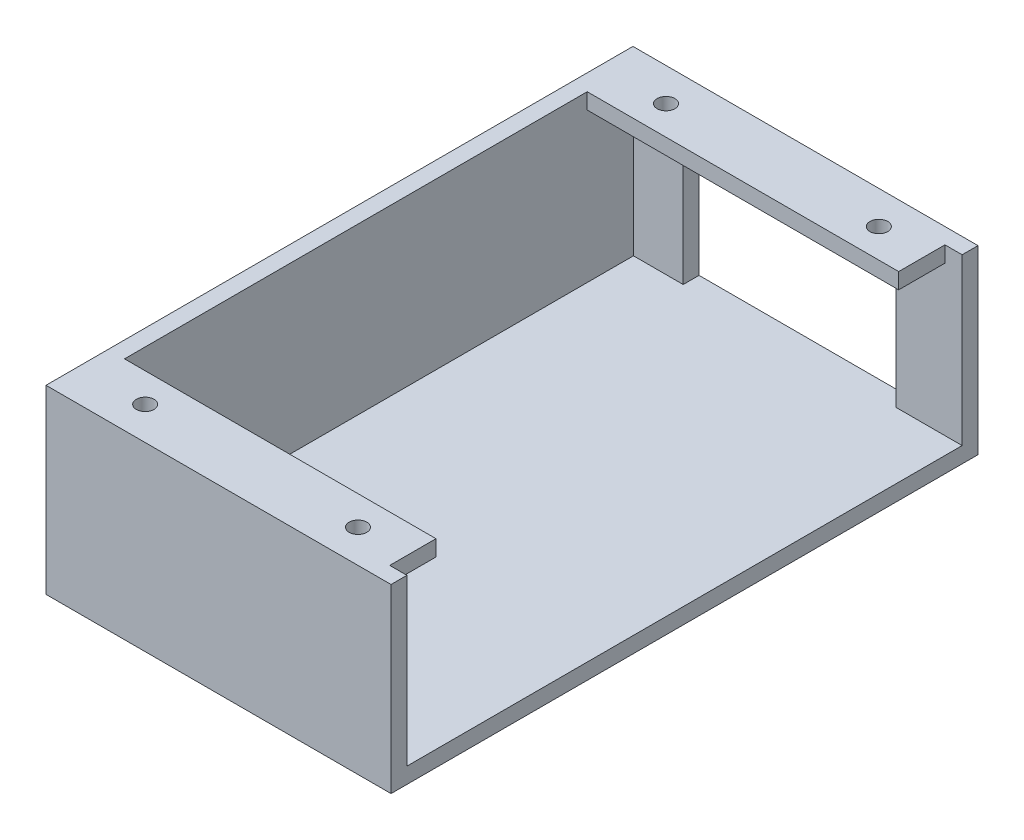
ISO-10303-21;
HEADER;
FILE_DESCRIPTION(('STEP AP214'),'2;1');
FILE_NAME('part.step','',(''),(''),'','','');
FILE_SCHEMA(('AUTOMOTIVE_DESIGN { 1 0 10303 214 1 1 1 1 }'));
ENDSEC;
DATA;
#1=APPLICATION_CONTEXT('core data for automotive mechanical design processes');
#2=APPLICATION_PROTOCOL_DEFINITION('international standard','automotive_design',2000,#1);
#3=PRODUCT_CONTEXT('',#1,'mechanical');
#4=PRODUCT('Part','Part','',(#3));
#5=PRODUCT_RELATED_PRODUCT_CATEGORY('part','',(#4));
#6=PRODUCT_DEFINITION_FORMATION('','',#4);
#7=PRODUCT_DEFINITION_CONTEXT('part definition',#1,'design');
#8=PRODUCT_DEFINITION('design','',#6,#7);
#9=PRODUCT_DEFINITION_SHAPE('','',#8);
#10=(LENGTH_UNIT() NAMED_UNIT(*) SI_UNIT(.MILLI.,.METRE.));
#11=(NAMED_UNIT(*) PLANE_ANGLE_UNIT() SI_UNIT($,.RADIAN.));
#12=(NAMED_UNIT(*) SI_UNIT($,.STERADIAN.) SOLID_ANGLE_UNIT());
#13=UNCERTAINTY_MEASURE_WITH_UNIT(LENGTH_MEASURE(1.E-05),#10,'distance_accuracy_value','');
#14=(GEOMETRIC_REPRESENTATION_CONTEXT(3) GLOBAL_UNCERTAINTY_ASSIGNED_CONTEXT((#13)) GLOBAL_UNIT_ASSIGNED_CONTEXT((#10,
#11,#12)) REPRESENTATION_CONTEXT('',''));
#15=CARTESIAN_POINT('',(0.,0.,0.));
#16=DIRECTION('',(0.,0.,1.));
#17=DIRECTION('',(1.,0.,0.));
#18=AXIS2_PLACEMENT_3D('',#15,#16,#17);
#19=CARTESIAN_POINT('',(0.,-5.08,10.16));
#20=DIRECTION('',(0.,0.,1.));
#21=DIRECTION('',(1.,0.,0.));
#22=AXIS2_PLACEMENT_3D('',#19,#20,#21);
#23=PLANE('',#22);
#24=DIRECTION('',(1.,0.,0.));
#25=VECTOR('',#24,1.);
#26=CARTESIAN_POINT('',(8.89,-2.54,10.16));
#27=LINE('',#26,#25);
#28=CARTESIAN_POINT('',(-8.89,-2.54,10.16));
#29=VERTEX_POINT('',#28);
#30=CARTESIAN_POINT('',(8.89,-2.54,10.16));
#31=VERTEX_POINT('',#30);
#32=EDGE_CURVE('E246',#29,#31,#27,.T.);
#33=ORIENTED_EDGE('',*,*,#32,.F.);
#34=DIRECTION('',(0.,1.,0.));
#35=VECTOR('',#34,1.);
#36=CARTESIAN_POINT('',(-8.89,-5.08,10.16));
#37=LINE('',#36,#35);
#38=CARTESIAN_POINT('',(-8.89,0.,10.16));
#39=VERTEX_POINT('',#38);
#40=EDGE_CURVE('E343',#29,#39,#37,.T.);
#41=ORIENTED_EDGE('',*,*,#40,.T.);
#42=DIRECTION('',(1.,0.,0.));
#43=VECTOR('',#42,1.);
#44=CARTESIAN_POINT('',(0.,0.,10.16));
#45=LINE('',#44,#43);
#46=CARTESIAN_POINT('',(8.89,0.,10.16));
#47=VERTEX_POINT('',#46);
#48=EDGE_CURVE('E330',#39,#47,#45,.T.);
#49=ORIENTED_EDGE('',*,*,#48,.T.);
#50=DIRECTION('',(0.,1.,0.));
#51=VECTOR('',#50,1.);
#52=CARTESIAN_POINT('',(8.89,-5.08,10.16));
#53=LINE('',#52,#51);
#54=EDGE_CURVE('E366',#31,#47,#53,.T.);
#55=ORIENTED_EDGE('',*,*,#54,.F.);
#56=EDGE_LOOP('',(#33,#41,#49,#55));
#57=FACE_BOUND('',#56,.T.);
#58=ADVANCED_FACE('F39',(#57),#23,.F.);
#59=CARTESIAN_POINT('',(0.,0.,0.));
#60=DIRECTION('',(0.,-1.,0.));
#61=DIRECTION('',(0.,0.,-1.));
#62=AXIS2_PLACEMENT_3D('',#59,#60,#61);
#63=PLANE('',#62);
#64=DIRECTION('',(0.,0.,-1.));
#65=VECTOR('',#64,1.);
#66=CARTESIAN_POINT('',(8.89000000000001,0.,0.));
#67=LINE('',#66,#65);
#68=CARTESIAN_POINT('',(8.89000000000001,0.,-10.16));
#69=VERTEX_POINT('',#68);
#70=CARTESIAN_POINT('',(8.89000000000001,0.,-15.24));
#71=VERTEX_POINT('',#70);
#72=EDGE_CURVE('E295',#69,#71,#67,.T.);
#73=ORIENTED_EDGE('',*,*,#72,.T.);
#74=DIRECTION('',(1.,0.,0.));
#75=VECTOR('',#74,1.);
#76=CARTESIAN_POINT('',(0.,0.,-15.24));
#77=LINE('',#76,#75);
#78=CARTESIAN_POINT('',(-8.89,0.,-15.24));
#79=VERTEX_POINT('',#78);
#80=EDGE_CURVE('E300',#79,#71,#77,.T.);
#81=ORIENTED_EDGE('',*,*,#80,.F.);
#82=DIRECTION('',(0.,0.,-1.));
#83=VECTOR('',#82,1.);
#84=CARTESIAN_POINT('',(-8.89,0.,0.));
#85=LINE('',#84,#83);
#86=CARTESIAN_POINT('',(-8.89,0.,-10.16));
#87=VERTEX_POINT('',#86);
#88=EDGE_CURVE('E314',#87,#79,#85,.T.);
#89=ORIENTED_EDGE('',*,*,#88,.F.);
#90=DIRECTION('',(1.,0.,0.));
#91=VECTOR('',#90,1.);
#92=CARTESIAN_POINT('',(0.,0.,-10.16));
#93=LINE('',#92,#91);
#94=EDGE_CURVE('E310',#87,#69,#93,.T.);
#95=ORIENTED_EDGE('',*,*,#94,.T.);
#96=EDGE_LOOP('',(#73,#81,#89,#95));
#97=FACE_BOUND('',#96,.T.);
#98=DIRECTION('',(1.,0.,0.));
#99=VECTOR('',#98,1.);
#100=CARTESIAN_POINT('',(-33.147,0.,-56.388));
#101=LINE('',#100,#99);
#102=CARTESIAN_POINT('',(-33.147,0.,-56.388));
#103=VERTEX_POINT('',#102);
#104=CARTESIAN_POINT('',(33.147,0.,-56.388));
#105=VERTEX_POINT('',#104);
#106=EDGE_CURVE('E554',#103,#105,#101,.T.);
#107=ORIENTED_EDGE('',*,*,#106,.T.);
#108=DIRECTION('',(0.,0.,1.));
#109=VECTOR('',#108,1.);
#110=CARTESIAN_POINT('',(33.147,0.,-56.388));
#111=LINE('',#110,#109);
#112=CARTESIAN_POINT('',(33.147,0.,56.388));
#113=VERTEX_POINT('',#112);
#114=EDGE_CURVE('E558',#105,#113,#111,.T.);
#115=ORIENTED_EDGE('',*,*,#114,.T.);
#116=DIRECTION('',(1.,0.,0.));
#117=VECTOR('',#116,1.);
#118=CARTESIAN_POINT('',(-33.147,0.,56.388));
#119=LINE('',#118,#117);
#120=CARTESIAN_POINT('',(-33.147,0.,56.388));
#121=VERTEX_POINT('',#120);
#122=EDGE_CURVE('E562',#121,#113,#119,.T.);
#123=ORIENTED_EDGE('',*,*,#122,.F.);
#124=DIRECTION('',(0.,0.,1.));
#125=VECTOR('',#124,1.);
#126=CARTESIAN_POINT('',(-33.147,0.,-56.388));
#127=LINE('',#126,#125);
#128=EDGE_CURVE('E566',#103,#121,#127,.T.);
#129=ORIENTED_EDGE('',*,*,#128,.F.);
#130=EDGE_LOOP('',(#107,#115,#123,#129));
#131=FACE_BOUND('',#130,.T.);
#132=DIRECTION('',(0.,0.,1.));
#133=VECTOR('',#132,1.);
#134=CARTESIAN_POINT('',(8.89,0.,0.));
#135=LINE('',#134,#133);
#136=CARTESIAN_POINT('',(8.89,0.,15.24));
#137=VERTEX_POINT('',#136);
#138=EDGE_CURVE('E347',#47,#137,#135,.T.);
#139=ORIENTED_EDGE('',*,*,#138,.F.);
#140=ORIENTED_EDGE('',*,*,#48,.F.);
#141=DIRECTION('',(0.,0.,1.));
#142=VECTOR('',#141,1.);
#143=CARTESIAN_POINT('',(-8.88999999999999,0.,0.));
#144=LINE('',#143,#142);
#145=CARTESIAN_POINT('',(-8.89,0.,15.24));
#146=VERTEX_POINT('',#145);
#147=EDGE_CURVE('E335',#39,#146,#144,.T.);
#148=ORIENTED_EDGE('',*,*,#147,.T.);
#149=DIRECTION('',(1.,0.,0.));
#150=VECTOR('',#149,1.);
#151=CARTESIAN_POINT('',(0.,0.,15.24));
#152=LINE('',#151,#150);
#153=EDGE_CURVE('E351',#146,#137,#152,.T.);
#154=ORIENTED_EDGE('',*,*,#153,.T.);
#155=EDGE_LOOP('',(#139,#140,#148,#154));
#156=FACE_BOUND('',#155,.T.);
#157=ADVANCED_FACE('F592',(#97,#131,#156),#63,.T.);
#158=CARTESIAN_POINT('',(-30.,34.798,-53.34));
#159=DIRECTION('',(0.,0.,1.));
#160=DIRECTION('',(1.,0.,0.));
#161=AXIS2_PLACEMENT_3D('',#158,#159,#160);
#162=PLANE('',#161);
#163=DIRECTION('',(0.,-1.,0.));
#164=VECTOR('',#163,1.);
#165=CARTESIAN_POINT('',(20.447,3.048,-53.34));
#166=LINE('',#165,#164);
#167=CARTESIAN_POINT('',(20.447,23.368,-53.34));
#168=VERTEX_POINT('',#167);
#169=CARTESIAN_POINT('',(20.447,3.048,-53.34));
#170=VERTEX_POINT('',#169);
#171=EDGE_CURVE('E369',#168,#170,#166,.T.);
#172=ORIENTED_EDGE('',*,*,#171,.T.);
#173=DIRECTION('',(-1.,0.,0.));
#174=VECTOR('',#173,1.);
#175=CARTESIAN_POINT('',(-30.,3.048,-53.34));
#176=LINE('',#175,#174);
#177=CARTESIAN_POINT('',(33.147,3.048,-53.34));
#178=VERTEX_POINT('',#177);
#179=EDGE_CURVE('E521',#178,#170,#176,.T.);
#180=ORIENTED_EDGE('',*,*,#179,.F.);
#181=DIRECTION('',(0.,1.,0.));
#182=VECTOR('',#181,1.);
#183=CARTESIAN_POINT('',(33.147,3.048,-53.34));
#184=LINE('',#183,#182);
#185=CARTESIAN_POINT('',(33.147,34.798,-53.34));
#186=VERTEX_POINT('',#185);
#187=EDGE_CURVE('E446',#178,#186,#184,.T.);
#188=ORIENTED_EDGE('',*,*,#187,.T.);
#189=DIRECTION('',(1.,0.,0.));
#190=VECTOR('',#189,1.);
#191=CARTESIAN_POINT('',(29.845,34.798,-53.34));
#192=LINE('',#191,#190);
#193=CARTESIAN_POINT('',(29.845,34.798,-53.34));
#194=VERTEX_POINT('',#193);
#195=EDGE_CURVE('E453',#194,#186,#192,.T.);
#196=ORIENTED_EDGE('',*,*,#195,.F.);
#197=DIRECTION('',(0.,1.,0.));
#198=VECTOR('',#197,1.);
#199=CARTESIAN_POINT('',(29.845,3.048,-53.34));
#200=LINE('',#199,#198);
#201=CARTESIAN_POINT('',(29.845,31.75,-53.34));
#202=VERTEX_POINT('',#201);
#203=EDGE_CURVE('E445',#202,#194,#200,.T.);
#204=ORIENTED_EDGE('',*,*,#203,.F.);
#205=DIRECTION('',(-1.,0.,0.));
#206=VECTOR('',#205,1.);
#207=CARTESIAN_POINT('',(-30.,31.75,-53.34));
#208=LINE('',#207,#206);
#209=CARTESIAN_POINT('',(-30.,31.75,-53.34));
#210=VERTEX_POINT('',#209);
#211=EDGE_CURVE('E504',#202,#210,#208,.T.);
#212=ORIENTED_EDGE('',*,*,#211,.T.);
#213=DIRECTION('',(0.,-1.,0.));
#214=VECTOR('',#213,1.);
#215=CARTESIAN_POINT('',(-30.,34.798,-53.34));
#216=LINE('',#215,#214);
#217=CARTESIAN_POINT('',(-30.,3.048,-53.34));
#218=VERTEX_POINT('',#217);
#219=EDGE_CURVE('E533',#210,#218,#216,.T.);
#220=ORIENTED_EDGE('',*,*,#219,.T.);
#221=CARTESIAN_POINT('',(-20.447,3.048,-53.34));
#222=VERTEX_POINT('',#221);
#223=EDGE_CURVE('E514',#222,#218,#176,.T.);
#224=ORIENTED_EDGE('',*,*,#223,.F.);
#225=DIRECTION('',(0.,1.,0.));
#226=VECTOR('',#225,1.);
#227=CARTESIAN_POINT('',(-20.447,3.048,-53.34));
#228=LINE('',#227,#226);
#229=CARTESIAN_POINT('',(-20.447,23.368,-53.34));
#230=VERTEX_POINT('',#229);
#231=EDGE_CURVE('E396',#222,#230,#228,.T.);
#232=ORIENTED_EDGE('',*,*,#231,.T.);
#233=DIRECTION('',(1.,0.,0.));
#234=VECTOR('',#233,1.);
#235=CARTESIAN_POINT('',(20.447,23.368,-53.34));
#236=LINE('',#235,#234);
#237=EDGE_CURVE('E391',#230,#168,#236,.T.);
#238=ORIENTED_EDGE('',*,*,#237,.T.);
#239=EDGE_LOOP('',(#172,#180,#188,#196,#204,#212,#220,#224,#232,#238));
#240=FACE_BOUND('',#239,.T.);
#241=ADVANCED_FACE('F635',(#240),#162,.T.);
#242=CARTESIAN_POINT('',(-33.147,3.048,-56.388));
#243=DIRECTION('',(0.,0.,-1.));
#244=DIRECTION('',(-1.,0.,0.));
#245=AXIS2_PLACEMENT_3D('',#242,#243,#244);
#246=PLANE('',#245);
#247=DIRECTION('',(0.,-1.,0.));
#248=VECTOR('',#247,1.);
#249=CARTESIAN_POINT('',(20.447,3.048,-56.388));
#250=LINE('',#249,#248);
#251=CARTESIAN_POINT('',(20.447,23.368,-56.388));
#252=VERTEX_POINT('',#251);
#253=CARTESIAN_POINT('',(20.447,3.048,-56.388));
#254=VERTEX_POINT('',#253);
#255=EDGE_CURVE('E383',#252,#254,#250,.T.);
#256=ORIENTED_EDGE('',*,*,#255,.F.);
#257=DIRECTION('',(1.,0.,0.));
#258=VECTOR('',#257,1.);
#259=CARTESIAN_POINT('',(20.447,23.368,-56.388));
#260=LINE('',#259,#258);
#261=CARTESIAN_POINT('',(-20.447,23.368,-56.388));
#262=VERTEX_POINT('',#261);
#263=EDGE_CURVE('E370',#262,#252,#260,.T.);
#264=ORIENTED_EDGE('',*,*,#263,.F.);
#265=DIRECTION('',(0.,1.,0.));
#266=VECTOR('',#265,1.);
#267=CARTESIAN_POINT('',(-20.447,3.048,-56.388));
#268=LINE('',#267,#266);
#269=CARTESIAN_POINT('',(-20.447,3.048,-56.388));
#270=VERTEX_POINT('',#269);
#271=EDGE_CURVE('E375',#270,#262,#268,.T.);
#272=ORIENTED_EDGE('',*,*,#271,.F.);
#273=DIRECTION('',(-1.,0.,0.));
#274=VECTOR('',#273,1.);
#275=CARTESIAN_POINT('',(20.447,3.048,-56.388));
#276=LINE('',#275,#274);
#277=EDGE_CURVE('E379',#254,#270,#276,.T.);
#278=ORIENTED_EDGE('',*,*,#277,.F.);
#279=EDGE_LOOP('',(#256,#264,#272,#278));
#280=FACE_BOUND('',#279,.T.);
#281=ORIENTED_EDGE('',*,*,#106,.F.);
#282=DIRECTION('',(0.,-1.,0.));
#283=VECTOR('',#282,1.);
#284=CARTESIAN_POINT('',(-33.147,3.048,-56.388));
#285=LINE('',#284,#283);
#286=CARTESIAN_POINT('',(-33.147,34.798,-56.388));
#287=VERTEX_POINT('',#286);
#288=EDGE_CURVE('E48',#287,#103,#285,.T.);
#289=ORIENTED_EDGE('',*,*,#288,.F.);
#290=DIRECTION('',(-1.,0.,0.));
#291=VECTOR('',#290,1.);
#292=CARTESIAN_POINT('',(-33.147,34.798,-56.388));
#293=LINE('',#292,#291);
#294=CARTESIAN_POINT('',(33.147,34.798,-56.388));
#295=VERTEX_POINT('',#294);
#296=EDGE_CURVE('E542',#295,#287,#293,.T.);
#297=ORIENTED_EDGE('',*,*,#296,.F.);
#298=DIRECTION('',(0.,-1.,0.));
#299=VECTOR('',#298,1.);
#300=CARTESIAN_POINT('',(33.147,3.048,-56.388));
#301=LINE('',#300,#299);
#302=EDGE_CURVE('E569',#295,#105,#301,.T.);
#303=ORIENTED_EDGE('',*,*,#302,.T.);
#304=EDGE_LOOP('',(#281,#289,#297,#303));
#305=FACE_BOUND('',#304,.T.);
#306=ADVANCED_FACE('F41',(#280,#305),#246,.T.);
#307=CARTESIAN_POINT('',(-33.147,3.048,-56.388));
#308=DIRECTION('',(1.,0.,0.));
#309=DIRECTION('',(0.,0.,-1.));
#310=AXIS2_PLACEMENT_3D('',#307,#308,#309);
#311=PLANE('',#310);
#312=ORIENTED_EDGE('',*,*,#128,.T.);
#313=DIRECTION('',(0.,-1.,0.));
#314=VECTOR('',#313,1.);
#315=CARTESIAN_POINT('',(-33.147,3.048,56.388));
#316=LINE('',#315,#314);
#317=CARTESIAN_POINT('',(-33.147,34.798,56.388));
#318=VERTEX_POINT('',#317);
#319=EDGE_CURVE('E572',#318,#121,#316,.T.);
#320=ORIENTED_EDGE('',*,*,#319,.F.);
#321=DIRECTION('',(0.,0.,1.));
#322=VECTOR('',#321,1.);
#323=CARTESIAN_POINT('',(-33.147,34.798,-56.388));
#324=LINE('',#323,#322);
#325=EDGE_CURVE('E546',#287,#318,#324,.T.);
#326=ORIENTED_EDGE('',*,*,#325,.F.);
#327=ORIENTED_EDGE('',*,*,#288,.T.);
#328=EDGE_LOOP('',(#312,#320,#326,#327));
#329=FACE_BOUND('',#328,.T.);
#330=ADVANCED_FACE('F595',(#329),#311,.F.);
#331=CARTESIAN_POINT('',(-33.147,3.048,56.388));
#332=DIRECTION('',(0.,0.,-1.));
#333=DIRECTION('',(-1.,0.,0.));
#334=AXIS2_PLACEMENT_3D('',#331,#332,#333);
#335=PLANE('',#334);
#336=ORIENTED_EDGE('',*,*,#122,.T.);
#337=DIRECTION('',(0.,-1.,0.));
#338=VECTOR('',#337,1.);
#339=CARTESIAN_POINT('',(33.147,3.048,56.388));
#340=LINE('',#339,#338);
#341=CARTESIAN_POINT('',(33.147,34.798,56.388));
#342=VERTEX_POINT('',#341);
#343=EDGE_CURVE('E576',#342,#113,#340,.T.);
#344=ORIENTED_EDGE('',*,*,#343,.F.);
#345=DIRECTION('',(1.,0.,0.));
#346=VECTOR('',#345,1.);
#347=CARTESIAN_POINT('',(-33.147,34.798,56.388));
#348=LINE('',#347,#346);
#349=EDGE_CURVE('E550',#318,#342,#348,.T.);
#350=ORIENTED_EDGE('',*,*,#349,.F.);
#351=ORIENTED_EDGE('',*,*,#319,.T.);
#352=EDGE_LOOP('',(#336,#344,#350,#351));
#353=FACE_BOUND('',#352,.T.);
#354=ADVANCED_FACE('F599',(#353),#335,.F.);
#355=CARTESIAN_POINT('',(33.147,3.048,-56.388));
#356=DIRECTION('',(1.,0.,0.));
#357=DIRECTION('',(0.,0.,-1.));
#358=AXIS2_PLACEMENT_3D('',#355,#356,#357);
#359=PLANE('',#358);
#360=DIRECTION('',(0.,-1.,0.));
#361=VECTOR('',#360,1.);
#362=CARTESIAN_POINT('',(33.147,3.048,53.34));
#363=LINE('',#362,#361);
#364=CARTESIAN_POINT('',(33.147,34.798,53.34));
#365=VERTEX_POINT('',#364);
#366=CARTESIAN_POINT('',(33.147,3.048,53.34));
#367=VERTEX_POINT('',#366);
#368=EDGE_CURVE('E441',#365,#367,#363,.T.);
#369=ORIENTED_EDGE('',*,*,#368,.F.);
#370=DIRECTION('',(0.,0.,-1.));
#371=VECTOR('',#370,1.);
#372=CARTESIAN_POINT('',(33.147,34.798,-56.388));
#373=LINE('',#372,#371);
#374=EDGE_CURVE('E538',#342,#365,#373,.T.);
#375=ORIENTED_EDGE('',*,*,#374,.F.);
#376=ORIENTED_EDGE('',*,*,#343,.T.);
#377=ORIENTED_EDGE('',*,*,#114,.F.);
#378=ORIENTED_EDGE('',*,*,#302,.F.);
#379=EDGE_CURVE('E537',#186,#295,#373,.T.);
#380=ORIENTED_EDGE('',*,*,#379,.F.);
#381=ORIENTED_EDGE('',*,*,#187,.F.);
#382=DIRECTION('',(0.,0.,-1.));
#383=VECTOR('',#382,1.);
#384=CARTESIAN_POINT('',(33.147,3.048,53.34));
#385=LINE('',#384,#383);
#386=EDGE_CURVE('E457',#367,#178,#385,.T.);
#387=ORIENTED_EDGE('',*,*,#386,.F.);
#388=EDGE_LOOP('',(#369,#375,#376,#377,#378,#380,#381,#387));
#389=FACE_BOUND('',#388,.T.);
#390=ADVANCED_FACE('F587',(#389),#359,.T.);
#391=CARTESIAN_POINT('',(0.,34.798,0.));
#392=DIRECTION('',(0.,1.,0.));
#393=DIRECTION('',(0.,0.,1.));
#394=AXIS2_PLACEMENT_3D('',#391,#392,#393);
#395=PLANE('',#394);
#396=CARTESIAN_POINT('',(-20.447,34.798,-50.038));
#397=DIRECTION('',(0.,1.,0.));
#398=DIRECTION('',(0.,0.,1.));
#399=AXIS2_PLACEMENT_3D('',#396,#397,#398);
#400=CIRCLE('',#399,1.69999999999999);
#401=CARTESIAN_POINT('',(-20.447,34.798,-48.338));
#402=VERTEX_POINT('',#401);
#403=EDGE_CURVE('E374',#402,#402,#400,.T.);
#404=ORIENTED_EDGE('',*,*,#403,.F.);
#405=EDGE_LOOP('',(#404));
#406=FACE_BOUND('',#405,.T.);
#407=CARTESIAN_POINT('',(20.447,34.798,-50.038));
#408=DIRECTION('',(0.,1.,0.));
#409=DIRECTION('',(0.,0.,1.));
#410=AXIS2_PLACEMENT_3D('',#407,#408,#409);
#411=CIRCLE('',#410,1.69999999999999);
#412=CARTESIAN_POINT('',(20.447,34.798,-48.338));
#413=VERTEX_POINT('',#412);
#414=EDGE_CURVE('E417',#413,#413,#411,.T.);
#415=ORIENTED_EDGE('',*,*,#414,.F.);
#416=EDGE_LOOP('',(#415));
#417=FACE_BOUND('',#416,.T.);
#418=CARTESIAN_POINT('',(-20.447,34.798,50.038));
#419=DIRECTION('',(0.,1.,0.));
#420=DIRECTION('',(0.,0.,1.));
#421=AXIS2_PLACEMENT_3D('',#418,#419,#420);
#422=CIRCLE('',#421,1.69999999999999);
#423=CARTESIAN_POINT('',(-20.447,34.798,51.738));
#424=VERTEX_POINT('',#423);
#425=EDGE_CURVE('E425',#424,#424,#422,.T.);
#426=ORIENTED_EDGE('',*,*,#425,.F.);
#427=EDGE_LOOP('',(#426));
#428=FACE_BOUND('',#427,.T.);
#429=CARTESIAN_POINT('',(20.447,34.798,50.038));
#430=DIRECTION('',(0.,1.,0.));
#431=DIRECTION('',(0.,0.,1.));
#432=AXIS2_PLACEMENT_3D('',#429,#430,#431);
#433=CIRCLE('',#432,1.69999999999999);
#434=CARTESIAN_POINT('',(20.447,34.798,51.738));
#435=VERTEX_POINT('',#434);
#436=EDGE_CURVE('E433',#435,#435,#433,.T.);
#437=ORIENTED_EDGE('',*,*,#436,.F.);
#438=EDGE_LOOP('',(#437));
#439=FACE_BOUND('',#438,.T.);
#440=ORIENTED_EDGE('',*,*,#195,.T.);
#441=ORIENTED_EDGE('',*,*,#379,.T.);
#442=ORIENTED_EDGE('',*,*,#296,.T.);
#443=ORIENTED_EDGE('',*,*,#325,.T.);
#444=ORIENTED_EDGE('',*,*,#349,.T.);
#445=ORIENTED_EDGE('',*,*,#374,.T.);
#446=DIRECTION('',(1.,0.,0.));
#447=VECTOR('',#446,1.);
#448=CARTESIAN_POINT('',(29.845,34.798,53.34));
#449=LINE('',#448,#447);
#450=CARTESIAN_POINT('',(29.845,34.798,53.34));
#451=VERTEX_POINT('',#450);
#452=EDGE_CURVE('E463',#451,#365,#449,.T.);
#453=ORIENTED_EDGE('',*,*,#452,.F.);
#454=DIRECTION('',(0.,0.,1.));
#455=VECTOR('',#454,1.);
#456=CARTESIAN_POINT('',(29.845,34.798,53.34));
#457=LINE('',#456,#455);
#458=CARTESIAN_POINT('',(29.845,34.798,44.45));
#459=VERTEX_POINT('',#458);
#460=EDGE_CURVE('E449',#459,#451,#457,.T.);
#461=ORIENTED_EDGE('',*,*,#460,.F.);
#462=DIRECTION('',(-1.,0.,0.));
#463=VECTOR('',#462,1.);
#464=CARTESIAN_POINT('',(-30.,34.798,44.45));
#465=LINE('',#464,#463);
#466=CARTESIAN_POINT('',(-30.,34.798,44.45));
#467=VERTEX_POINT('',#466);
#468=EDGE_CURVE('E479',#459,#467,#465,.T.);
#469=ORIENTED_EDGE('',*,*,#468,.T.);
#470=DIRECTION('',(0.,0.,1.));
#471=VECTOR('',#470,1.);
#472=CARTESIAN_POINT('',(-30.,34.798,-53.34));
#473=LINE('',#472,#471);
#474=CARTESIAN_POINT('',(-30.,34.798,-44.45));
#475=VERTEX_POINT('',#474);
#476=EDGE_CURVE('E515',#475,#467,#473,.T.);
#477=ORIENTED_EDGE('',*,*,#476,.F.);
#478=DIRECTION('',(1.,0.,0.));
#479=VECTOR('',#478,1.);
#480=CARTESIAN_POINT('',(-30.,34.798,-44.45));
#481=LINE('',#480,#479);
#482=CARTESIAN_POINT('',(29.845,34.798,-44.45));
#483=VERTEX_POINT('',#482);
#484=EDGE_CURVE('E496',#475,#483,#481,.T.);
#485=ORIENTED_EDGE('',*,*,#484,.T.);
#486=EDGE_CURVE('E450',#194,#483,#457,.T.);
#487=ORIENTED_EDGE('',*,*,#486,.F.);
#488=EDGE_LOOP('',(#440,#441,#442,#443,#444,#445,#453,#461,#469,#477,#485,#487));
#489=FACE_BOUND('',#488,.T.);
#490=ADVANCED_FACE('F601',(#406,#417,#428,#439,#489),#395,.T.);
#491=CARTESIAN_POINT('',(-30.,34.798,-53.34));
#492=DIRECTION('',(1.,0.,0.));
#493=DIRECTION('',(0.,0.,-1.));
#494=AXIS2_PLACEMENT_3D('',#491,#492,#493);
#495=PLANE('',#494);
#496=DIRECTION('',(0.,1.,0.));
#497=VECTOR('',#496,1.);
#498=CARTESIAN_POINT('',(-30.,31.75,44.45));
#499=LINE('',#498,#497);
#500=CARTESIAN_POINT('',(-30.,31.75,44.45));
#501=VERTEX_POINT('',#500);
#502=EDGE_CURVE('E490',#501,#467,#499,.T.);
#503=ORIENTED_EDGE('',*,*,#502,.F.);
#504=DIRECTION('',(0.,0.,1.));
#505=VECTOR('',#504,1.);
#506=CARTESIAN_POINT('',(-30.,31.75,53.34));
#507=LINE('',#506,#505);
#508=CARTESIAN_POINT('',(-30.,31.75,53.34));
#509=VERTEX_POINT('',#508);
#510=EDGE_CURVE('E480',#501,#509,#507,.T.);
#511=ORIENTED_EDGE('',*,*,#510,.T.);
#512=DIRECTION('',(0.,-1.,0.));
#513=VECTOR('',#512,1.);
#514=CARTESIAN_POINT('',(-30.,34.798,53.34));
#515=LINE('',#514,#513);
#516=CARTESIAN_POINT('',(-30.,3.048,53.34));
#517=VERTEX_POINT('',#516);
#518=EDGE_CURVE('E519',#509,#517,#515,.T.);
#519=ORIENTED_EDGE('',*,*,#518,.T.);
#520=DIRECTION('',(0.,0.,1.));
#521=VECTOR('',#520,1.);
#522=CARTESIAN_POINT('',(-30.,3.048,-53.34));
#523=LINE('',#522,#521);
#524=EDGE_CURVE('E525',#218,#517,#523,.T.);
#525=ORIENTED_EDGE('',*,*,#524,.F.);
#526=ORIENTED_EDGE('',*,*,#219,.F.);
#527=DIRECTION('',(0.,0.,1.));
#528=VECTOR('',#527,1.);
#529=CARTESIAN_POINT('',(-30.,31.75,-53.34));
#530=LINE('',#529,#528);
#531=CARTESIAN_POINT('',(-30.,31.75,-44.45));
#532=VERTEX_POINT('',#531);
#533=EDGE_CURVE('E497',#210,#532,#530,.T.);
#534=ORIENTED_EDGE('',*,*,#533,.T.);
#535=DIRECTION('',(0.,1.,0.));
#536=VECTOR('',#535,1.);
#537=CARTESIAN_POINT('',(-30.,31.75,-44.45));
#538=LINE('',#537,#536);
#539=EDGE_CURVE('E507',#532,#475,#538,.T.);
#540=ORIENTED_EDGE('',*,*,#539,.T.);
#541=ORIENTED_EDGE('',*,*,#476,.T.);
#542=EDGE_LOOP('',(#503,#511,#519,#525,#526,#534,#540,#541));
#543=FACE_BOUND('',#542,.T.);
#544=ADVANCED_FACE('F621',(#543),#495,.T.);
#545=CARTESIAN_POINT('',(-30.,34.798,53.34));
#546=DIRECTION('',(0.,0.,-1.));
#547=DIRECTION('',(-1.,0.,0.));
#548=AXIS2_PLACEMENT_3D('',#545,#546,#547);
#549=PLANE('',#548);
#550=ORIENTED_EDGE('',*,*,#368,.T.);
#551=DIRECTION('',(1.,0.,0.));
#552=VECTOR('',#551,1.);
#553=CARTESIAN_POINT('',(-30.,3.048,53.34));
#554=LINE('',#553,#552);
#555=EDGE_CURVE('E520',#517,#367,#554,.T.);
#556=ORIENTED_EDGE('',*,*,#555,.F.);
#557=ORIENTED_EDGE('',*,*,#518,.F.);
#558=DIRECTION('',(1.,0.,0.));
#559=VECTOR('',#558,1.);
#560=CARTESIAN_POINT('',(-30.,31.75,53.34));
#561=LINE('',#560,#559);
#562=CARTESIAN_POINT('',(29.845,31.75,53.34));
#563=VERTEX_POINT('',#562);
#564=EDGE_CURVE('E483',#509,#563,#561,.T.);
#565=ORIENTED_EDGE('',*,*,#564,.T.);
#566=DIRECTION('',(0.,-1.,0.));
#567=VECTOR('',#566,1.);
#568=CARTESIAN_POINT('',(29.845,3.048,53.34));
#569=LINE('',#568,#567);
#570=EDGE_CURVE('E442',#451,#563,#569,.T.);
#571=ORIENTED_EDGE('',*,*,#570,.F.);
#572=ORIENTED_EDGE('',*,*,#452,.T.);
#573=EDGE_LOOP('',(#550,#556,#557,#565,#571,#572));
#574=FACE_BOUND('',#573,.T.);
#575=ADVANCED_FACE('F607',(#574),#549,.T.);
#576=CARTESIAN_POINT('',(0.,3.048,0.));
#577=DIRECTION('',(0.,-1.,0.));
#578=DIRECTION('',(0.,0.,-1.));
#579=AXIS2_PLACEMENT_3D('',#576,#577,#578);
#580=PLANE('',#579);
#581=ORIENTED_EDGE('',*,*,#555,.T.);
#582=ORIENTED_EDGE('',*,*,#386,.T.);
#583=ORIENTED_EDGE('',*,*,#179,.T.);
#584=DIRECTION('',(0.,0.,-1.));
#585=VECTOR('',#584,1.);
#586=CARTESIAN_POINT('',(20.447,3.048,56.389));
#587=LINE('',#586,#585);
#588=EDGE_CURVE('E390',#170,#254,#587,.T.);
#589=ORIENTED_EDGE('',*,*,#588,.T.);
#590=ORIENTED_EDGE('',*,*,#277,.T.);
#591=DIRECTION('',(0.,0.,-1.));
#592=VECTOR('',#591,1.);
#593=CARTESIAN_POINT('',(-20.447,3.048,56.389));
#594=LINE('',#593,#592);
#595=EDGE_CURVE('E386',#222,#270,#594,.T.);
#596=ORIENTED_EDGE('',*,*,#595,.F.);
#597=ORIENTED_EDGE('',*,*,#223,.T.);
#598=ORIENTED_EDGE('',*,*,#524,.T.);
#599=EDGE_LOOP('',(#581,#582,#583,#589,#590,#596,#597,#598));
#600=FACE_BOUND('',#599,.T.);
#601=ADVANCED_FACE('F630',(#600),#580,.F.);
#602=CARTESIAN_POINT('',(-30.,31.75,-44.45));
#603=DIRECTION('',(0.,0.,1.));
#604=DIRECTION('',(1.,0.,0.));
#605=AXIS2_PLACEMENT_3D('',#602,#603,#604);
#606=PLANE('',#605);
#607=DIRECTION('',(0.,-1.,0.));
#608=VECTOR('',#607,1.);
#609=CARTESIAN_POINT('',(29.845,31.75,-44.45));
#610=LINE('',#609,#608);
#611=CARTESIAN_POINT('',(29.845,31.75,-44.45));
#612=VERTEX_POINT('',#611);
#613=EDGE_CURVE('E476',#483,#612,#610,.T.);
#614=ORIENTED_EDGE('',*,*,#613,.F.);
#615=ORIENTED_EDGE('',*,*,#484,.F.);
#616=ORIENTED_EDGE('',*,*,#539,.F.);
#617=DIRECTION('',(1.,0.,0.));
#618=VECTOR('',#617,1.);
#619=CARTESIAN_POINT('',(-30.,31.75,-44.45));
#620=LINE('',#619,#618);
#621=EDGE_CURVE('E500',#532,#612,#620,.T.);
#622=ORIENTED_EDGE('',*,*,#621,.T.);
#623=EDGE_LOOP('',(#614,#615,#616,#622));
#624=FACE_BOUND('',#623,.T.);
#625=ADVANCED_FACE('F646',(#624),#606,.T.);
#626=CARTESIAN_POINT('',(0.,31.75,0.));
#627=DIRECTION('',(0.,1.,0.));
#628=DIRECTION('',(0.,0.,1.));
#629=AXIS2_PLACEMENT_3D('',#626,#627,#628);
#630=PLANE('',#629);
#631=CARTESIAN_POINT('',(-20.447,31.75,-50.038));
#632=DIRECTION('',(0.,1.,0.));
#633=DIRECTION('',(0.,0.,1.));
#634=AXIS2_PLACEMENT_3D('',#631,#632,#633);
#635=CIRCLE('',#634,1.69999999999999);
#636=CARTESIAN_POINT('',(-20.447,31.75,-48.338));
#637=VERTEX_POINT('',#636);
#638=EDGE_CURVE('E413',#637,#637,#635,.T.);
#639=ORIENTED_EDGE('',*,*,#638,.T.);
#640=EDGE_LOOP('',(#639));
#641=FACE_BOUND('',#640,.T.);
#642=CARTESIAN_POINT('',(20.447,31.75,-50.038));
#643=DIRECTION('',(0.,1.,0.));
#644=DIRECTION('',(0.,0.,1.));
#645=AXIS2_PLACEMENT_3D('',#642,#643,#644);
#646=CIRCLE('',#645,1.69999999999999);
#647=CARTESIAN_POINT('',(20.447,31.75,-48.338));
#648=VERTEX_POINT('',#647);
#649=EDGE_CURVE('E421',#648,#648,#646,.T.);
#650=ORIENTED_EDGE('',*,*,#649,.T.);
#651=EDGE_LOOP('',(#650));
#652=FACE_BOUND('',#651,.T.);
#653=ORIENTED_EDGE('',*,*,#211,.F.);
#654=DIRECTION('',(0.,0.,1.));
#655=VECTOR('',#654,1.);
#656=CARTESIAN_POINT('',(29.845,31.75,0.));
#657=LINE('',#656,#655);
#658=EDGE_CURVE('E472',#202,#612,#657,.T.);
#659=ORIENTED_EDGE('',*,*,#658,.T.);
#660=ORIENTED_EDGE('',*,*,#621,.F.);
#661=ORIENTED_EDGE('',*,*,#533,.F.);
#662=EDGE_LOOP('',(#653,#659,#660,#661));
#663=FACE_BOUND('',#662,.T.);
#664=ADVANCED_FACE('F640',(#641,#652,#663),#630,.F.);
#665=CARTESIAN_POINT('',(-30.,31.75,44.45));
#666=DIRECTION('',(0.,0.,-1.));
#667=DIRECTION('',(-1.,0.,0.));
#668=AXIS2_PLACEMENT_3D('',#665,#666,#667);
#669=PLANE('',#668);
#670=DIRECTION('',(0.,1.,0.));
#671=VECTOR('',#670,1.);
#672=CARTESIAN_POINT('',(29.845,31.75,44.45));
#673=LINE('',#672,#671);
#674=CARTESIAN_POINT('',(29.845,31.75,44.45));
#675=VERTEX_POINT('',#674);
#676=EDGE_CURVE('E466',#675,#459,#673,.T.);
#677=ORIENTED_EDGE('',*,*,#676,.F.);
#678=DIRECTION('',(-1.,0.,0.));
#679=VECTOR('',#678,1.);
#680=CARTESIAN_POINT('',(-30.,31.75,44.45));
#681=LINE('',#680,#679);
#682=EDGE_CURVE('E487',#675,#501,#681,.T.);
#683=ORIENTED_EDGE('',*,*,#682,.T.);
#684=ORIENTED_EDGE('',*,*,#502,.T.);
#685=ORIENTED_EDGE('',*,*,#468,.F.);
#686=EDGE_LOOP('',(#677,#683,#684,#685));
#687=FACE_BOUND('',#686,.T.);
#688=ADVANCED_FACE('F616',(#687),#669,.T.);
#689=CARTESIAN_POINT('',(0.,31.75,0.));
#690=DIRECTION('',(0.,-1.,0.));
#691=DIRECTION('',(0.,0.,-1.));
#692=AXIS2_PLACEMENT_3D('',#689,#690,#691);
#693=PLANE('',#692);
#694=CARTESIAN_POINT('',(-20.447,31.75,50.038));
#695=DIRECTION('',(0.,-1.,0.));
#696=DIRECTION('',(0.,0.,-1.));
#697=AXIS2_PLACEMENT_3D('',#694,#695,#696);
#698=CIRCLE('',#697,1.69999999999999);
#699=CARTESIAN_POINT('',(-20.447,31.75,48.338));
#700=VERTEX_POINT('',#699);
#701=EDGE_CURVE('E429',#700,#700,#698,.T.);
#702=ORIENTED_EDGE('',*,*,#701,.F.);
#703=EDGE_LOOP('',(#702));
#704=FACE_BOUND('',#703,.T.);
#705=CARTESIAN_POINT('',(20.447,31.75,50.038));
#706=DIRECTION('',(0.,-1.,0.));
#707=DIRECTION('',(0.,0.,-1.));
#708=AXIS2_PLACEMENT_3D('',#705,#706,#707);
#709=CIRCLE('',#708,1.69999999999999);
#710=CARTESIAN_POINT('',(20.447,31.75,48.338));
#711=VERTEX_POINT('',#710);
#712=EDGE_CURVE('E437',#711,#711,#709,.T.);
#713=ORIENTED_EDGE('',*,*,#712,.F.);
#714=EDGE_LOOP('',(#713));
#715=FACE_BOUND('',#714,.T.);
#716=DIRECTION('',(0.,0.,-1.));
#717=VECTOR('',#716,1.);
#718=CARTESIAN_POINT('',(29.845,31.75,0.));
#719=LINE('',#718,#717);
#720=EDGE_CURVE('E11',#563,#675,#719,.T.);
#721=ORIENTED_EDGE('',*,*,#720,.F.);
#722=ORIENTED_EDGE('',*,*,#564,.F.);
#723=ORIENTED_EDGE('',*,*,#510,.F.);
#724=ORIENTED_EDGE('',*,*,#682,.F.);
#725=EDGE_LOOP('',(#721,#722,#723,#724));
#726=FACE_BOUND('',#725,.T.);
#727=ADVANCED_FACE('F625',(#704,#715,#726),#693,.T.);
#728=CARTESIAN_POINT('',(29.845,0.,0.));
#729=DIRECTION('',(-1.,0.,0.));
#730=DIRECTION('',(0.,0.,1.));
#731=AXIS2_PLACEMENT_3D('',#728,#729,#730);
#732=PLANE('',#731);
#733=ORIENTED_EDGE('',*,*,#613,.T.);
#734=ORIENTED_EDGE('',*,*,#658,.F.);
#735=ORIENTED_EDGE('',*,*,#203,.T.);
#736=ORIENTED_EDGE('',*,*,#486,.T.);
#737=EDGE_LOOP('',(#733,#734,#735,#736));
#738=FACE_BOUND('',#737,.T.);
#739=ADVANCED_FACE('F649',(#738),#732,.F.);
#740=ORIENTED_EDGE('',*,*,#676,.T.);
#741=ORIENTED_EDGE('',*,*,#460,.T.);
#742=ORIENTED_EDGE('',*,*,#570,.T.);
#743=ORIENTED_EDGE('',*,*,#720,.T.);
#744=EDGE_LOOP('',(#740,#741,#742,#743));
#745=FACE_BOUND('',#744,.T.);
#746=ADVANCED_FACE('F937',(#745),#732,.F.);
#747=CARTESIAN_POINT('',(20.447,34.798,50.038));
#748=DIRECTION('',(0.,1.,0.));
#749=DIRECTION('',(0.,0.,1.));
#750=AXIS2_PLACEMENT_3D('',#747,#748,#749);
#751=CYLINDRICAL_SURFACE('',#750,1.69999999999999);
#752=ORIENTED_EDGE('',*,*,#436,.T.);
#753=EDGE_LOOP('',(#752));
#754=FACE_BOUND('',#753,.T.);
#755=ORIENTED_EDGE('',*,*,#712,.T.);
#756=EDGE_LOOP('',(#755));
#757=FACE_BOUND('',#756,.T.);
#758=ADVANCED_FACE('F927',(#754,#757),#751,.F.);
#759=CARTESIAN_POINT('',(-20.447,34.798,50.038));
#760=DIRECTION('',(0.,1.,0.));
#761=DIRECTION('',(0.,0.,1.));
#762=AXIS2_PLACEMENT_3D('',#759,#760,#761);
#763=CYLINDRICAL_SURFACE('',#762,1.69999999999999);
#764=ORIENTED_EDGE('',*,*,#425,.T.);
#765=EDGE_LOOP('',(#764));
#766=FACE_BOUND('',#765,.T.);
#767=ORIENTED_EDGE('',*,*,#701,.T.);
#768=EDGE_LOOP('',(#767));
#769=FACE_BOUND('',#768,.T.);
#770=ADVANCED_FACE('F917',(#766,#769),#763,.F.);
#771=CARTESIAN_POINT('',(20.447,34.798,-50.038));
#772=DIRECTION('',(0.,1.,0.));
#773=DIRECTION('',(0.,0.,1.));
#774=AXIS2_PLACEMENT_3D('',#771,#772,#773);
#775=CYLINDRICAL_SURFACE('',#774,1.69999999999999);
#776=ORIENTED_EDGE('',*,*,#649,.F.);
#777=EDGE_LOOP('',(#776));
#778=FACE_BOUND('',#777,.T.);
#779=ORIENTED_EDGE('',*,*,#414,.T.);
#780=EDGE_LOOP('',(#779));
#781=FACE_BOUND('',#780,.T.);
#782=ADVANCED_FACE('F672',(#778,#781),#775,.F.);
#783=CARTESIAN_POINT('',(-20.447,34.798,-50.038));
#784=DIRECTION('',(0.,1.,0.));
#785=DIRECTION('',(0.,0.,1.));
#786=AXIS2_PLACEMENT_3D('',#783,#784,#785);
#787=CYLINDRICAL_SURFACE('',#786,1.69999999999999);
#788=ORIENTED_EDGE('',*,*,#638,.F.);
#789=EDGE_LOOP('',(#788));
#790=FACE_BOUND('',#789,.T.);
#791=ORIENTED_EDGE('',*,*,#403,.T.);
#792=EDGE_LOOP('',(#791));
#793=FACE_BOUND('',#792,.T.);
#794=ADVANCED_FACE('F665',(#790,#793),#787,.F.);
#795=CARTESIAN_POINT('',(20.447,3.048,56.389));
#796=DIRECTION('',(1.,0.,0.));
#797=DIRECTION('',(0.,0.,-1.));
#798=AXIS2_PLACEMENT_3D('',#795,#796,#797);
#799=PLANE('',#798);
#800=DIRECTION('',(0.,0.,-1.));
#801=VECTOR('',#800,1.);
#802=CARTESIAN_POINT('',(20.447,23.368,56.389));
#803=LINE('',#802,#801);
#804=EDGE_CURVE('E395',#168,#252,#803,.T.);
#805=ORIENTED_EDGE('',*,*,#804,.T.);
#806=ORIENTED_EDGE('',*,*,#255,.T.);
#807=ORIENTED_EDGE('',*,*,#588,.F.);
#808=ORIENTED_EDGE('',*,*,#171,.F.);
#809=EDGE_LOOP('',(#805,#806,#807,#808));
#810=FACE_BOUND('',#809,.T.);
#811=ADVANCED_FACE('F663',(#810),#799,.F.);
#812=CARTESIAN_POINT('',(20.447,23.368,56.389));
#813=DIRECTION('',(0.,1.,0.));
#814=DIRECTION('',(0.,0.,1.));
#815=AXIS2_PLACEMENT_3D('',#812,#813,#814);
#816=PLANE('',#815);
#817=DIRECTION('',(0.,0.,-1.));
#818=VECTOR('',#817,1.);
#819=CARTESIAN_POINT('',(-20.447,23.368,56.389));
#820=LINE('',#819,#818);
#821=EDGE_CURVE('E400',#230,#262,#820,.T.);
#822=ORIENTED_EDGE('',*,*,#821,.T.);
#823=ORIENTED_EDGE('',*,*,#263,.T.);
#824=ORIENTED_EDGE('',*,*,#804,.F.);
#825=ORIENTED_EDGE('',*,*,#237,.F.);
#826=EDGE_LOOP('',(#822,#823,#824,#825));
#827=FACE_BOUND('',#826,.T.);
#828=ADVANCED_FACE('F662',(#827),#816,.F.);
#829=CARTESIAN_POINT('',(-20.447,3.048,56.389));
#830=DIRECTION('',(-1.,0.,0.));
#831=DIRECTION('',(0.,0.,1.));
#832=AXIS2_PLACEMENT_3D('',#829,#830,#831);
#833=PLANE('',#832);
#834=ORIENTED_EDGE('',*,*,#595,.T.);
#835=ORIENTED_EDGE('',*,*,#271,.T.);
#836=ORIENTED_EDGE('',*,*,#821,.F.);
#837=ORIENTED_EDGE('',*,*,#231,.F.);
#838=EDGE_LOOP('',(#834,#835,#836,#837));
#839=FACE_BOUND('',#838,.T.);
#840=ADVANCED_FACE('F659',(#839),#833,.F.);
#841=CARTESIAN_POINT('',(8.89,-5.08,0.));
#842=DIRECTION('',(-1.,0.,0.));
#843=DIRECTION('',(0.,0.,1.));
#844=AXIS2_PLACEMENT_3D('',#841,#842,#843);
#845=PLANE('',#844);
#846=ORIENTED_EDGE('',*,*,#138,.T.);
#847=DIRECTION('',(0.,1.,0.));
#848=VECTOR('',#847,1.);
#849=CARTESIAN_POINT('',(8.89,-5.08,15.24));
#850=LINE('',#849,#848);
#851=CARTESIAN_POINT('',(8.89,-5.08,15.24));
#852=VERTEX_POINT('',#851);
#853=EDGE_CURVE('E362',#852,#137,#850,.T.);
#854=ORIENTED_EDGE('',*,*,#853,.F.);
#855=DIRECTION('',(0.,0.,1.));
#856=VECTOR('',#855,1.);
#857=CARTESIAN_POINT('',(8.89,-5.08,0.));
#858=LINE('',#857,#856);
#859=CARTESIAN_POINT('',(8.89,-5.08,5.08));
#860=VERTEX_POINT('',#859);
#861=EDGE_CURVE('E331',#860,#852,#858,.T.);
#862=ORIENTED_EDGE('',*,*,#861,.F.);
#863=DIRECTION('',(0.,-1.,0.));
#864=VECTOR('',#863,1.);
#865=CARTESIAN_POINT('',(8.89,-5.08,5.08));
#866=LINE('',#865,#864);
#867=CARTESIAN_POINT('',(8.89,-2.54,5.08));
#868=VERTEX_POINT('',#867);
#869=EDGE_CURVE('E272',#868,#860,#866,.T.);
#870=ORIENTED_EDGE('',*,*,#869,.F.);
#871=DIRECTION('',(0.,0.,1.));
#872=VECTOR('',#871,1.);
#873=CARTESIAN_POINT('',(8.89,-2.54,5.08));
#874=LINE('',#873,#872);
#875=EDGE_CURVE('E286',#868,#31,#874,.T.);
#876=ORIENTED_EDGE('',*,*,#875,.T.);
#877=ORIENTED_EDGE('',*,*,#54,.T.);
#878=EDGE_LOOP('',(#846,#854,#862,#870,#876,#877));
#879=FACE_BOUND('',#878,.T.);
#880=ADVANCED_FACE('F686',(#879),#845,.F.);
#881=CARTESIAN_POINT('',(0.,-5.08,15.24));
#882=DIRECTION('',(0.,0.,1.));
#883=DIRECTION('',(1.,0.,0.));
#884=AXIS2_PLACEMENT_3D('',#881,#882,#883);
#885=PLANE('',#884);
#886=ORIENTED_EDGE('',*,*,#153,.F.);
#887=DIRECTION('',(0.,1.,0.));
#888=VECTOR('',#887,1.);
#889=CARTESIAN_POINT('',(-8.89,-5.08,15.24));
#890=LINE('',#889,#888);
#891=CARTESIAN_POINT('',(-8.89,-5.08,15.24));
#892=VERTEX_POINT('',#891);
#893=EDGE_CURVE('E358',#892,#146,#890,.T.);
#894=ORIENTED_EDGE('',*,*,#893,.F.);
#895=DIRECTION('',(1.,0.,0.));
#896=VECTOR('',#895,1.);
#897=CARTESIAN_POINT('',(0.,-5.08,15.24));
#898=LINE('',#897,#896);
#899=EDGE_CURVE('E334',#892,#852,#898,.T.);
#900=ORIENTED_EDGE('',*,*,#899,.T.);
#901=ORIENTED_EDGE('',*,*,#853,.T.);
#902=EDGE_LOOP('',(#886,#894,#900,#901));
#903=FACE_BOUND('',#902,.T.);
#904=ADVANCED_FACE('F692',(#903),#885,.T.);
#905=CARTESIAN_POINT('',(-8.88999999999999,-5.08,0.));
#906=DIRECTION('',(-1.,0.,0.));
#907=DIRECTION('',(0.,0.,1.));
#908=AXIS2_PLACEMENT_3D('',#905,#906,#907);
#909=PLANE('',#908);
#910=ORIENTED_EDGE('',*,*,#147,.F.);
#911=ORIENTED_EDGE('',*,*,#40,.F.);
#912=DIRECTION('',(0.,0.,1.));
#913=VECTOR('',#912,1.);
#914=CARTESIAN_POINT('',(-8.89,-2.54,5.08));
#915=LINE('',#914,#913);
#916=CARTESIAN_POINT('',(-8.89,-2.54,5.08));
#917=VERTEX_POINT('',#916);
#918=EDGE_CURVE('E292',#917,#29,#915,.T.);
#919=ORIENTED_EDGE('',*,*,#918,.F.);
#920=DIRECTION('',(0.,1.,0.));
#921=VECTOR('',#920,1.);
#922=CARTESIAN_POINT('',(-8.89,-5.08,5.08));
#923=LINE('',#922,#921);
#924=CARTESIAN_POINT('',(-8.89,-5.08,5.08));
#925=VERTEX_POINT('',#924);
#926=EDGE_CURVE('E280',#925,#917,#923,.T.);
#927=ORIENTED_EDGE('',*,*,#926,.F.);
#928=DIRECTION('',(0.,0.,1.));
#929=VECTOR('',#928,1.);
#930=CARTESIAN_POINT('',(-8.88999999999999,-5.08,0.));
#931=LINE('',#930,#929);
#932=EDGE_CURVE('E339',#925,#892,#931,.T.);
#933=ORIENTED_EDGE('',*,*,#932,.T.);
#934=ORIENTED_EDGE('',*,*,#893,.T.);
#935=EDGE_LOOP('',(#910,#911,#919,#927,#933,#934));
#936=FACE_BOUND('',#935,.T.);
#937=ADVANCED_FACE('F697',(#936),#909,.T.);
#938=CARTESIAN_POINT('',(0.,-5.08,0.));
#939=DIRECTION('',(0.,-1.,0.));
#940=DIRECTION('',(0.,0.,-1.));
#941=AXIS2_PLACEMENT_3D('',#938,#939,#940);
#942=PLANE('',#941);
#943=ORIENTED_EDGE('',*,*,#932,.F.);
#944=DIRECTION('',(-1.,0.,0.));
#945=VECTOR('',#944,1.);
#946=CARTESIAN_POINT('',(8.89,-5.08,5.08));
#947=LINE('',#946,#945);
#948=EDGE_CURVE('E276',#860,#925,#947,.T.);
#949=ORIENTED_EDGE('',*,*,#948,.F.);
#950=ORIENTED_EDGE('',*,*,#861,.T.);
#951=ORIENTED_EDGE('',*,*,#899,.F.);
#952=EDGE_LOOP('',(#943,#949,#950,#951));
#953=FACE_BOUND('',#952,.T.);
#954=ADVANCED_FACE('F712',(#953),#942,.T.);
#955=CARTESIAN_POINT('',(8.89000000000001,-5.08,0.));
#956=DIRECTION('',(1.,0.,0.));
#957=DIRECTION('',(0.,0.,-1.));
#958=AXIS2_PLACEMENT_3D('',#955,#956,#957);
#959=PLANE('',#958);
#960=ORIENTED_EDGE('',*,*,#72,.F.);
#961=DIRECTION('',(0.,1.,0.));
#962=VECTOR('',#961,1.);
#963=CARTESIAN_POINT('',(8.89000000000001,-5.08,-10.16));
#964=LINE('',#963,#962);
#965=CARTESIAN_POINT('',(8.89000000000001,-2.54,-10.16));
#966=VERTEX_POINT('',#965);
#967=EDGE_CURVE('E242',#966,#69,#964,.T.);
#968=ORIENTED_EDGE('',*,*,#967,.F.);
#969=DIRECTION('',(0.,0.,-1.));
#970=VECTOR('',#969,1.);
#971=CARTESIAN_POINT('',(8.89,-2.54,-5.08));
#972=LINE('',#971,#970);
#973=CARTESIAN_POINT('',(8.89,-2.54,-5.08));
#974=VERTEX_POINT('',#973);
#975=EDGE_CURVE('E235',#974,#966,#972,.T.);
#976=ORIENTED_EDGE('',*,*,#975,.F.);
#977=DIRECTION('',(0.,-1.,0.));
#978=VECTOR('',#977,1.);
#979=CARTESIAN_POINT('',(8.89,-5.08,-5.08));
#980=LINE('',#979,#978);
#981=CARTESIAN_POINT('',(8.89,-5.08,-5.08));
#982=VERTEX_POINT('',#981);
#983=EDGE_CURVE('E240',#974,#982,#980,.T.);
#984=ORIENTED_EDGE('',*,*,#983,.T.);
#985=DIRECTION('',(0.,0.,-1.));
#986=VECTOR('',#985,1.);
#987=CARTESIAN_POINT('',(8.89000000000001,-5.08,0.));
#988=LINE('',#987,#986);
#989=CARTESIAN_POINT('',(8.89000000000001,-5.08,-15.24));
#990=VERTEX_POINT('',#989);
#991=EDGE_CURVE('E296',#982,#990,#988,.T.);
#992=ORIENTED_EDGE('',*,*,#991,.T.);
#993=DIRECTION('',(0.,1.,0.));
#994=VECTOR('',#993,1.);
#995=CARTESIAN_POINT('',(8.89000000000001,-5.08,-15.24));
#996=LINE('',#995,#994);
#997=EDGE_CURVE('E306',#990,#71,#996,.T.);
#998=ORIENTED_EDGE('',*,*,#997,.T.);
#999=EDGE_LOOP('',(#960,#968,#976,#984,#992,#998));
#1000=FACE_BOUND('',#999,.T.);
#1001=ADVANCED_FACE('F238',(#1000),#959,.T.);
#1002=CARTESIAN_POINT('',(0.,-5.08,-10.16));
#1003=DIRECTION('',(0.,0.,1.));
#1004=DIRECTION('',(1.,0.,0.));
#1005=AXIS2_PLACEMENT_3D('',#1002,#1003,#1004);
#1006=PLANE('',#1005);
#1007=DIRECTION('',(1.,0.,0.));
#1008=VECTOR('',#1007,1.);
#1009=CARTESIAN_POINT('',(8.89,-2.54,-10.16));
#1010=LINE('',#1009,#1008);
#1011=CARTESIAN_POINT('',(-8.89,-2.54,-10.16));
#1012=VERTEX_POINT('',#1011);
#1013=EDGE_CURVE('E55',#1012,#966,#1010,.T.);
#1014=ORIENTED_EDGE('',*,*,#1013,.T.);
#1015=ORIENTED_EDGE('',*,*,#967,.T.);
#1016=ORIENTED_EDGE('',*,*,#94,.F.);
#1017=DIRECTION('',(0.,1.,0.));
#1018=VECTOR('',#1017,1.);
#1019=CARTESIAN_POINT('',(-8.89,-5.08,-10.16));
#1020=LINE('',#1019,#1018);
#1021=EDGE_CURVE('E60',#1012,#87,#1020,.T.);
#1022=ORIENTED_EDGE('',*,*,#1021,.F.);
#1023=EDGE_LOOP('',(#1014,#1015,#1016,#1022));
#1024=FACE_BOUND('',#1023,.T.);
#1025=ADVANCED_FACE('F739',(#1024),#1006,.T.);
#1026=CARTESIAN_POINT('',(-8.89,-5.08,0.));
#1027=DIRECTION('',(1.,0.,0.));
#1028=DIRECTION('',(0.,0.,-1.));
#1029=AXIS2_PLACEMENT_3D('',#1026,#1027,#1028);
#1030=PLANE('',#1029);
#1031=ORIENTED_EDGE('',*,*,#88,.T.);
#1032=DIRECTION('',(0.,1.,0.));
#1033=VECTOR('',#1032,1.);
#1034=CARTESIAN_POINT('',(-8.89,-5.08,-15.24));
#1035=LINE('',#1034,#1033);
#1036=CARTESIAN_POINT('',(-8.89,-5.08,-15.24));
#1037=VERTEX_POINT('',#1036);
#1038=EDGE_CURVE('E323',#1037,#79,#1035,.T.);
#1039=ORIENTED_EDGE('',*,*,#1038,.F.);
#1040=DIRECTION('',(0.,0.,-1.));
#1041=VECTOR('',#1040,1.);
#1042=CARTESIAN_POINT('',(-8.89,-5.08,0.));
#1043=LINE('',#1042,#1041);
#1044=CARTESIAN_POINT('',(-8.89,-5.08,-5.08));
#1045=VERTEX_POINT('',#1044);
#1046=EDGE_CURVE('E299',#1045,#1037,#1043,.T.);
#1047=ORIENTED_EDGE('',*,*,#1046,.F.);
#1048=DIRECTION('',(0.,1.,0.));
#1049=VECTOR('',#1048,1.);
#1050=CARTESIAN_POINT('',(-8.89,-5.08,-5.08));
#1051=LINE('',#1050,#1049);
#1052=CARTESIAN_POINT('',(-8.89,-2.54,-5.08));
#1053=VERTEX_POINT('',#1052);
#1054=EDGE_CURVE('E261',#1045,#1053,#1051,.T.);
#1055=ORIENTED_EDGE('',*,*,#1054,.T.);
#1056=DIRECTION('',(0.,0.,-1.));
#1057=VECTOR('',#1056,1.);
#1058=CARTESIAN_POINT('',(-8.89,-2.54,-5.08));
#1059=LINE('',#1058,#1057);
#1060=EDGE_CURVE('E247',#1053,#1012,#1059,.T.);
#1061=ORIENTED_EDGE('',*,*,#1060,.T.);
#1062=ORIENTED_EDGE('',*,*,#1021,.T.);
#1063=EDGE_LOOP('',(#1031,#1039,#1047,#1055,#1061,#1062));
#1064=FACE_BOUND('',#1063,.T.);
#1065=ADVANCED_FACE('F735',(#1064),#1030,.F.);
#1066=CARTESIAN_POINT('',(0.,-5.08,-15.24));
#1067=DIRECTION('',(0.,0.,1.));
#1068=DIRECTION('',(1.,0.,0.));
#1069=AXIS2_PLACEMENT_3D('',#1066,#1067,#1068);
#1070=PLANE('',#1069);
#1071=ORIENTED_EDGE('',*,*,#80,.T.);
#1072=ORIENTED_EDGE('',*,*,#997,.F.);
#1073=DIRECTION('',(1.,0.,0.));
#1074=VECTOR('',#1073,1.);
#1075=CARTESIAN_POINT('',(0.,-5.08,-15.24));
#1076=LINE('',#1075,#1074);
#1077=EDGE_CURVE('E303',#1037,#990,#1076,.T.);
#1078=ORIENTED_EDGE('',*,*,#1077,.F.);
#1079=ORIENTED_EDGE('',*,*,#1038,.T.);
#1080=EDGE_LOOP('',(#1071,#1072,#1078,#1079));
#1081=FACE_BOUND('',#1080,.T.);
#1082=ADVANCED_FACE('F728',(#1081),#1070,.F.);
#1083=CARTESIAN_POINT('',(0.,-5.08,0.));
#1084=DIRECTION('',(0.,-1.,0.));
#1085=DIRECTION('',(0.,0.,-1.));
#1086=AXIS2_PLACEMENT_3D('',#1083,#1084,#1085);
#1087=PLANE('',#1086);
#1088=ORIENTED_EDGE('',*,*,#991,.F.);
#1089=DIRECTION('',(-1.,0.,0.));
#1090=VECTOR('',#1089,1.);
#1091=CARTESIAN_POINT('',(8.89,-5.08,-5.08));
#1092=LINE('',#1091,#1090);
#1093=EDGE_CURVE('E256',#982,#1045,#1092,.T.);
#1094=ORIENTED_EDGE('',*,*,#1093,.T.);
#1095=ORIENTED_EDGE('',*,*,#1046,.T.);
#1096=ORIENTED_EDGE('',*,*,#1077,.T.);
#1097=EDGE_LOOP('',(#1088,#1094,#1095,#1096));
#1098=FACE_BOUND('',#1097,.T.);
#1099=ADVANCED_FACE('F721',(#1098),#1087,.T.);
#1100=CARTESIAN_POINT('',(8.89,-2.54,5.08));
#1101=DIRECTION('',(0.,-1.,0.));
#1102=DIRECTION('',(0.,0.,-1.));
#1103=AXIS2_PLACEMENT_3D('',#1100,#1101,#1102);
#1104=PLANE('',#1103);
#1105=ORIENTED_EDGE('',*,*,#32,.T.);
#1106=ORIENTED_EDGE('',*,*,#875,.F.);
#1107=DIRECTION('',(1.,0.,0.));
#1108=VECTOR('',#1107,1.);
#1109=CARTESIAN_POINT('',(8.89,-2.54,5.08));
#1110=LINE('',#1109,#1108);
#1111=EDGE_CURVE('E283',#917,#868,#1110,.T.);
#1112=ORIENTED_EDGE('',*,*,#1111,.F.);
#1113=ORIENTED_EDGE('',*,*,#918,.T.);
#1114=EDGE_LOOP('',(#1105,#1106,#1112,#1113));
#1115=FACE_BOUND('',#1114,.T.);
#1116=ADVANCED_FACE('F719',(#1115),#1104,.F.);
#1117=CARTESIAN_POINT('',(0.,0.,5.08));
#1118=DIRECTION('',(0.,0.,1.));
#1119=DIRECTION('',(1.,0.,0.));
#1120=AXIS2_PLACEMENT_3D('',#1117,#1118,#1119);
#1121=PLANE('',#1120);
#1122=ORIENTED_EDGE('',*,*,#869,.T.);
#1123=ORIENTED_EDGE('',*,*,#948,.T.);
#1124=ORIENTED_EDGE('',*,*,#926,.T.);
#1125=ORIENTED_EDGE('',*,*,#1111,.T.);
#1126=EDGE_LOOP('',(#1122,#1123,#1124,#1125));
#1127=FACE_BOUND('',#1126,.T.);
#1128=ADVANCED_FACE('F717',(#1127),#1121,.F.);
#1129=CARTESIAN_POINT('',(8.89,-2.54,-5.08));
#1130=DIRECTION('',(0.,1.,0.));
#1131=DIRECTION('',(0.,0.,1.));
#1132=AXIS2_PLACEMENT_3D('',#1129,#1130,#1131);
#1133=PLANE('',#1132);
#1134=ORIENTED_EDGE('',*,*,#1013,.F.);
#1135=ORIENTED_EDGE('',*,*,#1060,.F.);
#1136=DIRECTION('',(1.,0.,0.));
#1137=VECTOR('',#1136,1.);
#1138=CARTESIAN_POINT('',(8.89,-2.54,-5.08));
#1139=LINE('',#1138,#1137);
#1140=EDGE_CURVE('E253',#1053,#974,#1139,.T.);
#1141=ORIENTED_EDGE('',*,*,#1140,.T.);
#1142=ORIENTED_EDGE('',*,*,#975,.T.);
#1143=EDGE_LOOP('',(#1134,#1135,#1141,#1142));
#1144=FACE_BOUND('',#1143,.T.);
#1145=ADVANCED_FACE('F259',(#1144),#1133,.T.);
#1146=CARTESIAN_POINT('',(0.,0.,-5.08));
#1147=DIRECTION('',(0.,0.,-1.));
#1148=DIRECTION('',(1.,0.,0.));
#1149=AXIS2_PLACEMENT_3D('',#1146,#1147,#1148);
#1150=PLANE('',#1149);
#1151=ORIENTED_EDGE('',*,*,#983,.F.);
#1152=ORIENTED_EDGE('',*,*,#1140,.F.);
#1153=ORIENTED_EDGE('',*,*,#1054,.F.);
#1154=ORIENTED_EDGE('',*,*,#1093,.F.);
#1155=EDGE_LOOP('',(#1151,#1152,#1153,#1154));
#1156=FACE_BOUND('',#1155,.T.);
#1157=ADVANCED_FACE('F251',(#1156),#1150,.F.);
#1158=CLOSED_SHELL('',(#58,#157,#241,#306,#330,#354,#390,#490,#544,#575,#601,#625,#664,#688,
#727,#739,#746,#758,#770,#782,#794,#811,#828,#840,#880,#904,#937,#954,#1001,#1025,#1065,#1082,
#1099,#1116,#1128,#1145,#1157));
#1159=MANIFOLD_SOLID_BREP('B2',#1158);
#1160=ADVANCED_BREP_SHAPE_REPRESENTATION('',(#18,#1159),#14);
#1161=SHAPE_DEFINITION_REPRESENTATION(#9,#1160);
ENDSEC;
END-ISO-10303-21;
